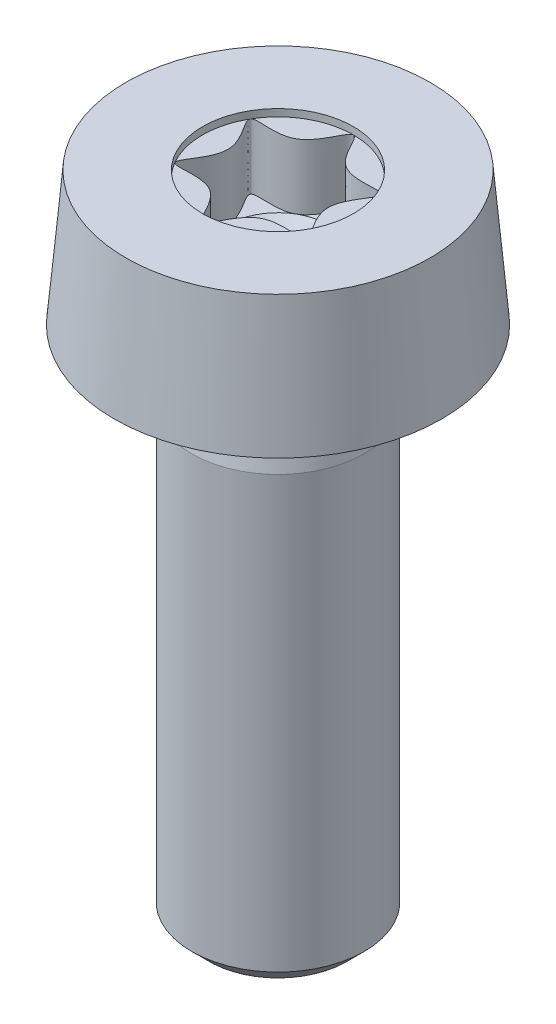
ISO-10303-21;
HEADER;
FILE_DESCRIPTION(('STEP AP214'),'2;1');
FILE_NAME('part.step','',(''),(''),'','','');
FILE_SCHEMA(('AUTOMOTIVE_DESIGN { 1 0 10303 214 1 1 1 1 }'));
ENDSEC;
DATA;
#1=APPLICATION_CONTEXT('core data for automotive mechanical design processes');
#2=APPLICATION_PROTOCOL_DEFINITION('international standard','automotive_design',2000,#1);
#3=PRODUCT_CONTEXT('',#1,'mechanical');
#4=PRODUCT('Part','Part','',(#3));
#5=PRODUCT_RELATED_PRODUCT_CATEGORY('part','',(#4));
#6=PRODUCT_DEFINITION_FORMATION('','',#4);
#7=PRODUCT_DEFINITION_CONTEXT('part definition',#1,'design');
#8=PRODUCT_DEFINITION('design','',#6,#7);
#9=PRODUCT_DEFINITION_SHAPE('','',#8);
#10=(LENGTH_UNIT() NAMED_UNIT(*) SI_UNIT(.MILLI.,.METRE.));
#11=(NAMED_UNIT(*) PLANE_ANGLE_UNIT() SI_UNIT($,.RADIAN.));
#12=(NAMED_UNIT(*) SI_UNIT($,.STERADIAN.) SOLID_ANGLE_UNIT());
#13=UNCERTAINTY_MEASURE_WITH_UNIT(LENGTH_MEASURE(1.E-05),#10,'distance_accuracy_value','');
#14=(GEOMETRIC_REPRESENTATION_CONTEXT(3) GLOBAL_UNCERTAINTY_ASSIGNED_CONTEXT((#13)) GLOBAL_UNIT_ASSIGNED_CONTEXT((#10,
#11,#12)) REPRESENTATION_CONTEXT('',''));
#15=CARTESIAN_POINT('',(0.,0.,0.));
#16=DIRECTION('',(0.,0.,1.));
#17=DIRECTION('',(1.,0.,0.));
#18=AXIS2_PLACEMENT_3D('',#15,#16,#17);
#19=CARTESIAN_POINT('',(0.,6.71,0.875));
#20=DIRECTION('',(0.,1.,0.));
#21=DIRECTION('',(0.,0.,1.));
#22=AXIS2_PLACEMENT_3D('',#19,#20,#21);
#23=PLANE('',#22);
#24=CARTESIAN_POINT('',(0.,6.71,-0.875));
#25=CARTESIAN_POINT('',(0.0629068366700437,6.71,-0.874999999999998));
#26=CARTESIAN_POINT('',(0.188720510010129,6.71,-0.326873511767858));
#27=CARTESIAN_POINT('',(0.995117959959479,6.71,-0.574531622058037));
#28=CARTESIAN_POINT('',(0.377441020020262,6.71,0.));
#29=CARTESIAN_POINT('',(0.995117959959478,6.71,0.574531622058034));
#30=CARTESIAN_POINT('',(0.188720510010133,6.71,0.326873511767863));
#31=CARTESIAN_POINT('',(0.,6.71,1.14906324411607));
#32=CARTESIAN_POINT('',(-0.188720510010137,6.71,0.326873511767868));
#33=CARTESIAN_POINT('',(-0.995117959959476,6.71,0.574531622058032));
#34=CARTESIAN_POINT('',(-0.377441020020261,6.71,0.));
#35=CARTESIAN_POINT('',(-0.995117959959476,6.71,-0.574531622058033));
#36=CARTESIAN_POINT('',(-0.188720510010136,6.71,-0.326873511767861));
#37=CARTESIAN_POINT('',(-0.0629068366700447,6.71,-0.875000000000002));
#38=CARTESIAN_POINT('',(0.,6.71,-0.875));
#39=B_SPLINE_CURVE_WITH_KNOTS('',3,(#24,#25,#26,#27,#28,#29,#30,#31,#32,#33,#34,#35,#36,#37,
#38),.UNSPECIFIED.,.T.,.F.,(4,1,1,1,1,1,1,1,1,1,1,1,4),(0.,0.0833333333333329,0.166666666666667,
0.25,0.333333333333334,0.416666666666668,0.5,0.583333333333333,0.666666666666666,0.75,
0.833333333333333,0.916666666666666,1.),.UNSPECIFIED.);
#40=CARTESIAN_POINT('',(0.291666666666665,6.71,-0.505181485540923));
#41=VERTEX_POINT('',#40);
#42=CARTESIAN_POINT('',(0.5833333333335,6.71,0.));
#43=VERTEX_POINT('',#42);
#44=EDGE_CURVE('E155',#41,#43,#39,.T.);
#45=ORIENTED_EDGE('',*,*,#44,.F.);
#46=CARTESIAN_POINT('',(0.,6.71,0.));
#47=DIRECTION('',(0.,-1.,0.));
#48=DIRECTION('',(0.,0.,-1.));
#49=AXIS2_PLACEMENT_3D('',#46,#47,#48);
#50=CIRCLE('',#49,0.5833333333335);
#51=EDGE_CURVE('E67',#41,#43,#50,.T.);
#52=ORIENTED_EDGE('',*,*,#51,.T.);
#53=EDGE_LOOP('',(#45,#52));
#54=FACE_BOUND('',#53,.T.);
#55=ADVANCED_FACE('F51',(#54),#23,.T.);
#56=CARTESIAN_POINT('',(0.291666666666749,6.71,0.505181485541067));
#57=VERTEX_POINT('',#56);
#58=EDGE_CURVE('E170',#43,#57,#39,.T.);
#59=ORIENTED_EDGE('',*,*,#58,.F.);
#60=EDGE_CURVE('E229',#43,#57,#50,.T.);
#61=ORIENTED_EDGE('',*,*,#60,.T.);
#62=EDGE_LOOP('',(#59,#61));
#63=FACE_BOUND('',#62,.T.);
#64=ADVANCED_FACE('F121',(#63),#23,.T.);
#65=CARTESIAN_POINT('',(-0.29166666666675,6.71,0.505181485541067));
#66=VERTEX_POINT('',#65);
#67=EDGE_CURVE('E163',#57,#66,#39,.T.);
#68=ORIENTED_EDGE('',*,*,#67,.F.);
#69=EDGE_CURVE('E232',#57,#66,#50,.T.);
#70=ORIENTED_EDGE('',*,*,#69,.T.);
#71=EDGE_LOOP('',(#68,#70));
#72=FACE_BOUND('',#71,.T.);
#73=ADVANCED_FACE('F129',(#72),#23,.T.);
#74=CARTESIAN_POINT('',(-0.5833333333335,6.71,0.));
#75=VERTEX_POINT('',#74);
#76=EDGE_CURVE('E161',#66,#75,#39,.T.);
#77=ORIENTED_EDGE('',*,*,#76,.F.);
#78=EDGE_CURVE('E237',#66,#75,#50,.T.);
#79=ORIENTED_EDGE('',*,*,#78,.T.);
#80=EDGE_LOOP('',(#77,#79));
#81=FACE_BOUND('',#80,.T.);
#82=ADVANCED_FACE('F144',(#81),#23,.T.);
#83=CARTESIAN_POINT('',(-0.291666666666752,6.71,-0.505181485541066));
#84=VERTEX_POINT('',#83);
#85=EDGE_CURVE('E152',#75,#84,#39,.T.);
#86=ORIENTED_EDGE('',*,*,#85,.F.);
#87=EDGE_CURVE('E240',#75,#84,#50,.T.);
#88=ORIENTED_EDGE('',*,*,#87,.T.);
#89=EDGE_LOOP('',(#86,#88));
#90=FACE_BOUND('',#89,.T.);
#91=ADVANCED_FACE('F135',(#90),#23,.T.);
#92=EDGE_CURVE('E148',#84,#41,#39,.T.);
#93=ORIENTED_EDGE('',*,*,#92,.F.);
#94=EDGE_CURVE('E150',#84,#41,#50,.T.);
#95=ORIENTED_EDGE('',*,*,#94,.T.);
#96=EDGE_LOOP('',(#93,#95));
#97=FACE_BOUND('',#96,.T.);
#98=ADVANCED_FACE('F124',(#97),#23,.T.);
#99=CARTESIAN_POINT('',(0.,7.55,0.));
#100=DIRECTION('',(0.,1.,0.));
#101=DIRECTION('',(0.,0.,1.));
#102=AXIS2_PLACEMENT_3D('',#99,#100,#101);
#103=PLANE('',#102);
#104=CARTESIAN_POINT('',(0.,7.55,0.));
#105=DIRECTION('',(0.,1.,0.));
#106=DIRECTION('',(0.,0.,1.));
#107=AXIS2_PLACEMENT_3D('',#104,#105,#106);
#108=CIRCLE('',#107,0.875);
#109=CARTESIAN_POINT('',(0.,7.55,0.875));
#110=VERTEX_POINT('',#109);
#111=EDGE_CURVE('E171',#110,#110,#108,.T.);
#112=ORIENTED_EDGE('',*,*,#111,.F.);
#113=EDGE_LOOP('',(#112));
#114=FACE_BOUND('',#113,.T.);
#115=CARTESIAN_POINT('',(0.,7.55,0.));
#116=DIRECTION('',(0.,-1.,0.));
#117=DIRECTION('',(0.,0.,-1.));
#118=AXIS2_PLACEMENT_3D('',#115,#116,#117);
#119=CIRCLE('',#118,1.76439257153483);
#120=CARTESIAN_POINT('',(0.,7.55,-1.76439257153483));
#121=VERTEX_POINT('',#120);
#122=EDGE_CURVE('E212',#121,#121,#119,.T.);
#123=ORIENTED_EDGE('',*,*,#122,.F.);
#124=EDGE_LOOP('',(#123));
#125=FACE_BOUND('',#124,.T.);
#126=ADVANCED_FACE('F134',(#114,#125),#103,.T.);
#127=CARTESIAN_POINT('',(0.,6.,0.));
#128=DIRECTION('',(0.,-1.,0.));
#129=DIRECTION('',(0.,0.,-1.));
#130=AXIS2_PLACEMENT_3D('',#127,#128,#129);
#131=CONICAL_SURFACE('',#130,1.9,0.0872664625997099);
#132=ORIENTED_EDGE('',*,*,#122,.T.);
#133=EDGE_LOOP('',(#132));
#134=FACE_BOUND('',#133,.T.);
#135=CARTESIAN_POINT('',(0.,6.,0.));
#136=DIRECTION('',(0.,-1.,0.));
#137=DIRECTION('',(0.,0.,-1.));
#138=AXIS2_PLACEMENT_3D('',#135,#136,#137);
#139=CIRCLE('',#138,1.9);
#140=CARTESIAN_POINT('',(0.,6.,-1.9));
#141=VERTEX_POINT('',#140);
#142=EDGE_CURVE('E217',#141,#141,#139,.T.);
#143=ORIENTED_EDGE('',*,*,#142,.F.);
#144=EDGE_LOOP('',(#143));
#145=FACE_BOUND('',#144,.T.);
#146=ADVANCED_FACE('F141',(#134,#145),#131,.T.);
#147=CARTESIAN_POINT('',(0.84,6.,0.));
#148=DIRECTION('',(0.,-1.,0.));
#149=DIRECTION('',(0.,0.,-1.));
#150=AXIS2_PLACEMENT_3D('',#147,#148,#149);
#151=PLANE('',#150);
#152=CARTESIAN_POINT('',(0.,6.,0.));
#153=DIRECTION('',(0.,-1.,0.));
#154=DIRECTION('',(0.,0.,-1.));
#155=AXIS2_PLACEMENT_3D('',#152,#153,#154);
#156=CIRCLE('',#155,0.961980390271856);
#157=CARTESIAN_POINT('',(0.,6.,-0.961980390271856));
#158=VERTEX_POINT('',#157);
#159=EDGE_CURVE('E208',#158,#158,#156,.F.);
#160=ORIENTED_EDGE('',*,*,#159,.T.);
#161=EDGE_LOOP('',(#160));
#162=FACE_BOUND('',#161,.T.);
#163=ORIENTED_EDGE('',*,*,#142,.T.);
#164=EDGE_LOOP('',(#163));
#165=FACE_BOUND('',#164,.T.);
#166=ADVANCED_FACE('F190',(#162,#165),#151,.T.);
#167=CARTESIAN_POINT('',(0.,5.2,0.));
#168=DIRECTION('',(0.,-1.,0.));
#169=DIRECTION('',(0.,0.,-1.));
#170=AXIS2_PLACEMENT_3D('',#167,#168,#169);
#171=CONICAL_SURFACE('',#170,1.,0.197395559849881);
#172=CARTESIAN_POINT('',(0.,5.88038838648618,0.));
#173=DIRECTION('',(0.,-1.,0.));
#174=DIRECTION('',(0.,0.,-1.));
#175=AXIS2_PLACEMENT_3D('',#172,#173,#174);
#176=CIRCLE('',#175,0.863922322702764);
#177=CARTESIAN_POINT('',(0.,5.88038838648618,-0.863922322702764));
#178=VERTEX_POINT('',#177);
#179=EDGE_CURVE('E211',#178,#178,#176,.T.);
#180=ORIENTED_EDGE('',*,*,#179,.T.);
#181=EDGE_LOOP('',(#180));
#182=FACE_BOUND('',#181,.T.);
#183=CARTESIAN_POINT('',(0.,5.2,0.));
#184=DIRECTION('',(0.,-1.,0.));
#185=DIRECTION('',(0.,0.,-1.));
#186=AXIS2_PLACEMENT_3D('',#183,#184,#185);
#187=CIRCLE('',#186,1.);
#188=CARTESIAN_POINT('',(0.,5.2,-1.));
#189=VERTEX_POINT('',#188);
#190=EDGE_CURVE('E169',#189,#189,#187,.T.);
#191=ORIENTED_EDGE('',*,*,#190,.F.);
#192=EDGE_LOOP('',(#191));
#193=FACE_BOUND('',#192,.T.);
#194=ADVANCED_FACE('F186',(#182,#193),#171,.T.);
#195=CARTESIAN_POINT('',(0.,0.,0.));
#196=DIRECTION('',(0.,-1.,0.));
#197=DIRECTION('',(0.,0.,-1.));
#198=AXIS2_PLACEMENT_3D('',#195,#196,#197);
#199=CYLINDRICAL_SURFACE('',#198,1.);
#200=CARTESIAN_POINT('',(0.,0.200000000000001,0.));
#201=DIRECTION('',(0.,-1.,0.));
#202=DIRECTION('',(0.,0.,-1.));
#203=AXIS2_PLACEMENT_3D('',#200,#201,#202);
#204=CIRCLE('',#203,1.);
#205=CARTESIAN_POINT('',(0.,0.200000000000001,-1.));
#206=VERTEX_POINT('',#205);
#207=EDGE_CURVE('E11',#206,#206,#204,.F.);
#208=ORIENTED_EDGE('',*,*,#207,.T.);
#209=EDGE_LOOP('',(#208));
#210=FACE_BOUND('',#209,.T.);
#211=ORIENTED_EDGE('',*,*,#190,.T.);
#212=EDGE_LOOP('',(#211));
#213=FACE_BOUND('',#212,.T.);
#214=ADVANCED_FACE('F182',(#210,#213),#199,.T.);
#215=CARTESIAN_POINT('',(1.,0.,0.));
#216=DIRECTION('',(0.,-1.,0.));
#217=DIRECTION('',(0.,0.,-1.));
#218=AXIS2_PLACEMENT_3D('',#215,#216,#217);
#219=PLANE('',#218);
#220=CARTESIAN_POINT('',(0.,0.,0.));
#221=DIRECTION('',(0.,-1.,0.));
#222=DIRECTION('',(0.,0.,-1.));
#223=AXIS2_PLACEMENT_3D('',#220,#221,#222);
#224=CIRCLE('',#223,0.799999999999999);
#225=CARTESIAN_POINT('',(0.,0.,-0.799999999999999));
#226=VERTEX_POINT('',#225);
#227=EDGE_CURVE('E60',#226,#226,#224,.T.);
#228=ORIENTED_EDGE('',*,*,#227,.T.);
#229=EDGE_LOOP('',(#228));
#230=FACE_BOUND('',#229,.T.);
#231=ADVANCED_FACE('F178',(#230),#219,.T.);
#232=CARTESIAN_POINT('',(0.,5.9,0.));
#233=DIRECTION('',(0.,-1.,0.));
#234=DIRECTION('',(0.,0.,-1.));
#235=AXIS2_PLACEMENT_3D('',#232,#233,#234);
#236=TOROIDAL_SURFACE('',#235,0.961980390271856,0.1);
#237=ORIENTED_EDGE('',*,*,#159,.F.);
#238=EDGE_LOOP('',(#237));
#239=FACE_BOUND('',#238,.T.);
#240=ORIENTED_EDGE('',*,*,#179,.F.);
#241=EDGE_LOOP('',(#240));
#242=FACE_BOUND('',#241,.T.);
#243=ADVANCED_FACE('F181',(#239,#242),#236,.F.);
#244=CARTESIAN_POINT('',(0.,7.466,0.));
#245=DIRECTION('',(0.,1.,0.));
#246=DIRECTION('',(0.,0.,1.));
#247=AXIS2_PLACEMENT_3D('',#244,#245,#246);
#248=CYLINDRICAL_SURFACE('',#247,0.875);
#249=ORIENTED_EDGE('',*,*,#111,.T.);
#250=EDGE_LOOP('',(#249));
#251=FACE_BOUND('',#250,.T.);
#252=CARTESIAN_POINT('',(0.,7.466,0.));
#253=DIRECTION('',(0.,1.,0.));
#254=DIRECTION('',(0.,0.,1.));
#255=AXIS2_PLACEMENT_3D('',#252,#253,#254);
#256=CIRCLE('',#255,0.875);
#257=CARTESIAN_POINT('',(0.757772228311384,7.466,0.4375));
#258=VERTEX_POINT('',#257);
#259=CARTESIAN_POINT('',(0.757772228311384,7.466,-0.4375));
#260=VERTEX_POINT('',#259);
#261=EDGE_CURVE('E254',#258,#260,#256,.T.);
#262=ORIENTED_EDGE('',*,*,#261,.F.);
#263=CARTESIAN_POINT('',(0.,7.466,0.875));
#264=VERTEX_POINT('',#263);
#265=EDGE_CURVE('E153',#264,#258,#256,.T.);
#266=ORIENTED_EDGE('',*,*,#265,.F.);
#267=CARTESIAN_POINT('',(-0.757772228311383,7.466,0.437500000000001));
#268=VERTEX_POINT('',#267);
#269=EDGE_CURVE('E239',#268,#264,#256,.T.);
#270=ORIENTED_EDGE('',*,*,#269,.F.);
#271=CARTESIAN_POINT('',(-0.757772228311384,7.466,-0.4375));
#272=VERTEX_POINT('',#271);
#273=EDGE_CURVE('E262',#272,#268,#256,.T.);
#274=ORIENTED_EDGE('',*,*,#273,.F.);
#275=CARTESIAN_POINT('',(0.,7.466,-0.875));
#276=VERTEX_POINT('',#275);
#277=EDGE_CURVE('E265',#276,#272,#256,.T.);
#278=ORIENTED_EDGE('',*,*,#277,.F.);
#279=EDGE_CURVE('E74',#260,#276,#256,.T.);
#280=ORIENTED_EDGE('',*,*,#279,.F.);
#281=EDGE_LOOP('',(#262,#266,#270,#274,#278,#280));
#282=FACE_BOUND('',#281,.T.);
#283=ADVANCED_FACE('F198',(#251,#282),#248,.F.);
#284=CARTESIAN_POINT('',(0.,7.466,0.));
#285=DIRECTION('',(0.,1.,0.));
#286=DIRECTION('',(0.,0.,1.));
#287=AXIS2_PLACEMENT_3D('',#284,#285,#286);
#288=PLANE('',#287);
#289=ORIENTED_EDGE('',*,*,#277,.T.);
#290=CARTESIAN_POINT('',(0.,7.466,-0.875));
#291=CARTESIAN_POINT('',(0.0629068366700437,7.466,-0.874999999999998));
#292=CARTESIAN_POINT('',(0.188720510010129,7.466,-0.326873511767858));
#293=CARTESIAN_POINT('',(0.995117959959479,7.466,-0.574531622058037));
#294=CARTESIAN_POINT('',(0.377441020020262,7.466,0.));
#295=CARTESIAN_POINT('',(0.995117959959478,7.466,0.574531622058034));
#296=CARTESIAN_POINT('',(0.188720510010133,7.466,0.326873511767863));
#297=CARTESIAN_POINT('',(0.,7.466,1.14906324411607));
#298=CARTESIAN_POINT('',(-0.188720510010137,7.466,0.326873511767868));
#299=CARTESIAN_POINT('',(-0.995117959959476,7.466,0.574531622058032));
#300=CARTESIAN_POINT('',(-0.377441020020261,7.466,0.));
#301=CARTESIAN_POINT('',(-0.995117959959476,7.466,-0.574531622058033));
#302=CARTESIAN_POINT('',(-0.188720510010136,7.466,-0.326873511767861));
#303=CARTESIAN_POINT('',(-0.0629068366700447,7.466,-0.875000000000002));
#304=CARTESIAN_POINT('',(0.,7.466,-0.875));
#305=B_SPLINE_CURVE_WITH_KNOTS('',3,(#290,#291,#292,#293,#294,#295,#296,#297,#298,#299,#300,
#301,#302,#303,#304),.UNSPECIFIED.,.T.,.F.,(4,1,1,1,1,1,1,1,1,1,1,1,4),(0.,0.0833333333333329,
0.166666666666667,0.25,0.333333333333334,0.416666666666668,0.5,0.583333333333333,
0.666666666666666,0.75,0.833333333333333,0.916666666666666,1.),.UNSPECIFIED.);
#306=EDGE_CURVE('E224',#276,#272,#305,.F.);
#307=ORIENTED_EDGE('',*,*,#306,.F.);
#308=EDGE_LOOP('',(#289,#307));
#309=FACE_BOUND('',#308,.T.);
#310=ADVANCED_FACE('F203',(#309),#288,.T.);
#311=ORIENTED_EDGE('',*,*,#273,.T.);
#312=EDGE_CURVE('E242',#272,#268,#305,.F.);
#313=ORIENTED_EDGE('',*,*,#312,.F.);
#314=EDGE_LOOP('',(#311,#313));
#315=FACE_BOUND('',#314,.T.);
#316=ADVANCED_FACE('F271',(#315),#288,.T.);
#317=ORIENTED_EDGE('',*,*,#269,.T.);
#318=EDGE_CURVE('E245',#268,#264,#305,.F.);
#319=ORIENTED_EDGE('',*,*,#318,.F.);
#320=EDGE_LOOP('',(#317,#319));
#321=FACE_BOUND('',#320,.T.);
#322=ADVANCED_FACE('F275',(#321),#288,.T.);
#323=ORIENTED_EDGE('',*,*,#265,.T.);
#324=EDGE_CURVE('E247',#264,#258,#305,.F.);
#325=ORIENTED_EDGE('',*,*,#324,.F.);
#326=EDGE_LOOP('',(#323,#325));
#327=FACE_BOUND('',#326,.T.);
#328=ADVANCED_FACE('F260',(#327),#288,.T.);
#329=ORIENTED_EDGE('',*,*,#261,.T.);
#330=EDGE_CURVE('E223',#258,#260,#305,.F.);
#331=ORIENTED_EDGE('',*,*,#330,.F.);
#332=EDGE_LOOP('',(#329,#331));
#333=FACE_BOUND('',#332,.T.);
#334=ADVANCED_FACE('F253',(#333),#288,.T.);
#335=ORIENTED_EDGE('',*,*,#279,.T.);
#336=EDGE_CURVE('E214',#260,#276,#305,.F.);
#337=ORIENTED_EDGE('',*,*,#336,.F.);
#338=EDGE_LOOP('',(#335,#337));
#339=FACE_BOUND('',#338,.T.);
#340=ADVANCED_FACE('F116',(#339),#288,.T.);
#341=DIRECTION('',(0.,1.,0.));
#342=VECTOR('',#341,1.);
#343=SURFACE_OF_LINEAR_EXTRUSION('',#39,#342);
#344=ORIENTED_EDGE('',*,*,#44,.T.);
#345=ORIENTED_EDGE('',*,*,#58,.T.);
#346=ORIENTED_EDGE('',*,*,#67,.T.);
#347=ORIENTED_EDGE('',*,*,#76,.T.);
#348=ORIENTED_EDGE('',*,*,#85,.T.);
#349=ORIENTED_EDGE('',*,*,#92,.T.);
#350=EDGE_LOOP('',(#344,#345,#346,#347,#348,#349));
#351=FACE_BOUND('',#350,.T.);
#352=ORIENTED_EDGE('',*,*,#336,.T.);
#353=ORIENTED_EDGE('',*,*,#306,.T.);
#354=ORIENTED_EDGE('',*,*,#312,.T.);
#355=ORIENTED_EDGE('',*,*,#318,.T.);
#356=ORIENTED_EDGE('',*,*,#324,.T.);
#357=ORIENTED_EDGE('',*,*,#330,.T.);
#358=EDGE_LOOP('',(#352,#353,#354,#355,#356,#357));
#359=FACE_BOUND('',#358,.T.);
#360=ADVANCED_FACE('F108',(#351,#359),#343,.T.);
#361=CARTESIAN_POINT('',(0.,6.155,0.));
#362=DIRECTION('',(0.,1.,0.));
#363=DIRECTION('',(0.,0.,1.));
#364=AXIS2_PLACEMENT_3D('',#361,#362,#363);
#365=CONICAL_SURFACE('',#364,0.,0.810283215640793);
#366=ORIENTED_EDGE('',*,*,#51,.F.);
#367=ORIENTED_EDGE('',*,*,#94,.F.);
#368=ORIENTED_EDGE('',*,*,#87,.F.);
#369=ORIENTED_EDGE('',*,*,#78,.F.);
#370=ORIENTED_EDGE('',*,*,#69,.F.);
#371=ORIENTED_EDGE('',*,*,#60,.F.);
#372=EDGE_LOOP('',(#366,#367,#368,#369,#370,#371));
#373=FACE_BOUND('',#372,.T.);
#374=CARTESIAN_POINT('',(0.,6.155,0.));
#375=VERTEX_POINT('',#374);
#376=VERTEX_LOOP('',#375);
#377=FACE_BOUND('',#376,.T.);
#378=ADVANCED_FACE('F106',(#373,#377),#365,.F.);
#379=CARTESIAN_POINT('',(0.,0.,0.));
#380=DIRECTION('',(0.,1.,0.));
#381=DIRECTION('',(0.,0.,1.));
#382=AXIS2_PLACEMENT_3D('',#379,#380,#381);
#383=CONICAL_SURFACE('',#382,0.799999999999999,0.785398163397447);
#384=ORIENTED_EDGE('',*,*,#207,.F.);
#385=EDGE_LOOP('',(#384));
#386=FACE_BOUND('',#385,.T.);
#387=ORIENTED_EDGE('',*,*,#227,.F.);
#388=EDGE_LOOP('',(#387));
#389=FACE_BOUND('',#388,.T.);
#390=ADVANCED_FACE('F54',(#386,#389),#383,.T.);
#391=CLOSED_SHELL('',(#55,#64,#73,#82,#91,#98,#126,#146,#166,#194,#214,#231,#243,#283,#310,#316,
#322,#328,#334,#340,#360,#378,#390));
#392=MANIFOLD_SOLID_BREP('B2',#391);
#393=ADVANCED_BREP_SHAPE_REPRESENTATION('',(#18,#392),#14);
#394=SHAPE_DEFINITION_REPRESENTATION(#9,#393);
ENDSEC;
END-ISO-10303-21;
